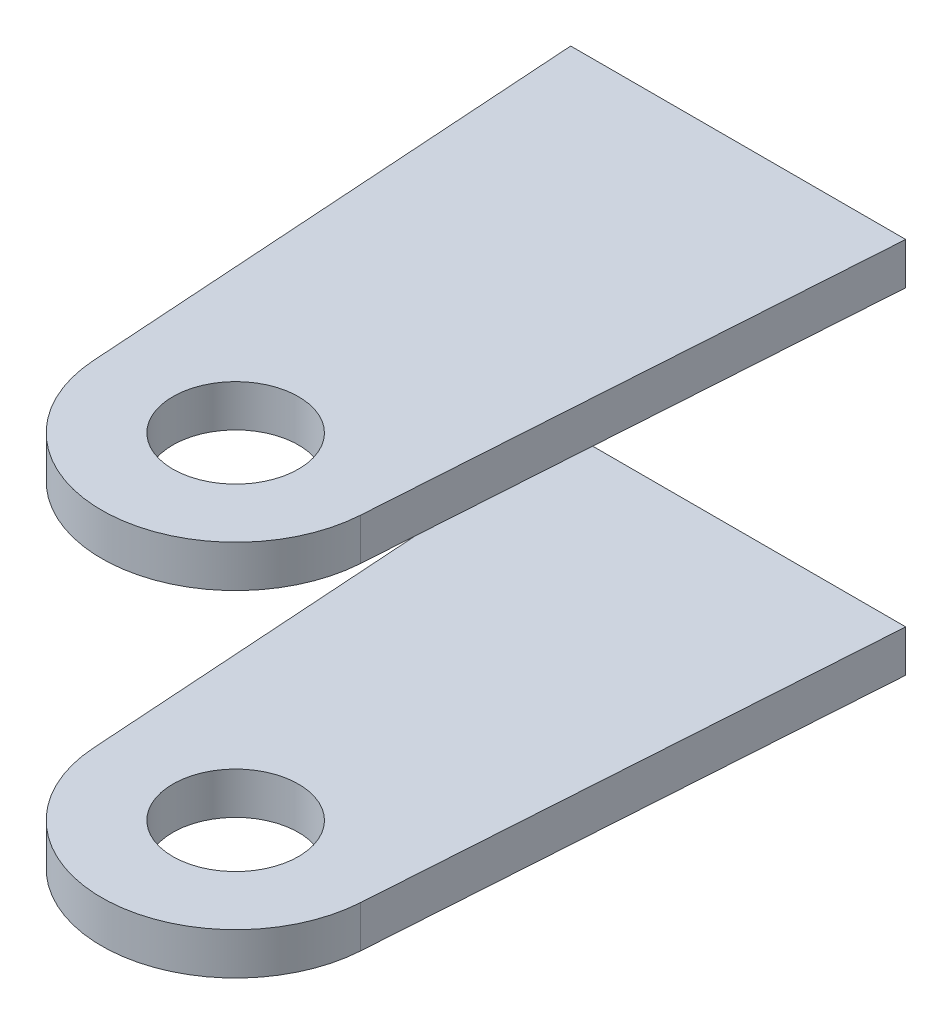
ISO-10303-21;
HEADER;
FILE_DESCRIPTION(('STEP AP214'),'2;1');
FILE_NAME('part.step','',(''),(''),'','','');
FILE_SCHEMA(('AUTOMOTIVE_DESIGN { 1 0 10303 214 1 1 1 1 }'));
ENDSEC;
DATA;
#1=APPLICATION_CONTEXT('core data for automotive mechanical design processes');
#2=APPLICATION_PROTOCOL_DEFINITION('international standard','automotive_design',2000,#1);
#3=PRODUCT_CONTEXT('',#1,'mechanical');
#4=PRODUCT('Part','Part','',(#3));
#5=PRODUCT_RELATED_PRODUCT_CATEGORY('part','',(#4));
#6=PRODUCT_DEFINITION_FORMATION('','',#4);
#7=PRODUCT_DEFINITION_CONTEXT('part definition',#1,'design');
#8=PRODUCT_DEFINITION('design','',#6,#7);
#9=PRODUCT_DEFINITION_SHAPE('','',#8);
#10=(LENGTH_UNIT() NAMED_UNIT(*) SI_UNIT(.MILLI.,.METRE.));
#11=(NAMED_UNIT(*) PLANE_ANGLE_UNIT() SI_UNIT($,.RADIAN.));
#12=(NAMED_UNIT(*) SI_UNIT($,.STERADIAN.) SOLID_ANGLE_UNIT());
#13=UNCERTAINTY_MEASURE_WITH_UNIT(LENGTH_MEASURE(1.E-05),#10,'distance_accuracy_value','');
#14=(GEOMETRIC_REPRESENTATION_CONTEXT(3) GLOBAL_UNCERTAINTY_ASSIGNED_CONTEXT((#13)) GLOBAL_UNIT_ASSIGNED_CONTEXT((#10,
#11,#12)) REPRESENTATION_CONTEXT('',''));
#15=CARTESIAN_POINT('',(0.,0.,0.));
#16=DIRECTION('',(0.,0.,1.));
#17=DIRECTION('',(1.,0.,0.));
#18=AXIS2_PLACEMENT_3D('',#15,#16,#17);
#19=CARTESIAN_POINT('',(0.,-14.30655,-38.1));
#20=DIRECTION('',(0.,0.,1.));
#21=DIRECTION('',(1.,0.,0.));
#22=AXIS2_PLACEMENT_3D('',#19,#20,#21);
#23=PLANE('',#22);
#24=DIRECTION('',(1.,0.,0.));
#25=VECTOR('',#24,1.);
#26=CARTESIAN_POINT('',(0.,-11.13155,-38.1));
#27=LINE('',#26,#25);
#28=CARTESIAN_POINT('',(-12.7,-11.13155,-38.1));
#29=VERTEX_POINT('',#28);
#30=CARTESIAN_POINT('',(12.7,-11.13155,-38.1));
#31=VERTEX_POINT('',#30);
#32=EDGE_CURVE('E119',#29,#31,#27,.T.);
#33=ORIENTED_EDGE('',*,*,#32,.T.);
#34=DIRECTION('',(0.,1.,0.));
#35=VECTOR('',#34,1.);
#36=CARTESIAN_POINT('',(12.7,-14.30655,-38.1));
#37=LINE('',#36,#35);
#38=CARTESIAN_POINT('',(12.7,-14.30655,-38.1));
#39=VERTEX_POINT('',#38);
#40=EDGE_CURVE('E12',#39,#31,#37,.T.);
#41=ORIENTED_EDGE('',*,*,#40,.F.);
#42=DIRECTION('',(1.,0.,0.));
#43=VECTOR('',#42,1.);
#44=CARTESIAN_POINT('',(0.,-14.30655,-38.1));
#45=LINE('',#44,#43);
#46=CARTESIAN_POINT('',(-12.7,-14.30655,-38.1));
#47=VERTEX_POINT('',#46);
#48=EDGE_CURVE('E71',#47,#39,#45,.T.);
#49=ORIENTED_EDGE('',*,*,#48,.F.);
#50=DIRECTION('',(0.,1.,0.));
#51=VECTOR('',#50,1.);
#52=CARTESIAN_POINT('',(-12.7,-14.30655,-38.1));
#53=LINE('',#52,#51);
#54=EDGE_CURVE('E56',#47,#29,#53,.T.);
#55=ORIENTED_EDGE('',*,*,#54,.T.);
#56=EDGE_LOOP('',(#33,#41,#49,#55));
#57=FACE_BOUND('',#56,.T.);
#58=ADVANCED_FACE('F53',(#57),#23,.F.);
#59=CARTESIAN_POINT('',(10.1378868864585,-14.30655,0.669962295486161));
#60=DIRECTION('',(0.997823512446701,0.,0.065941170815567));
#61=DIRECTION('',(0.065941170815567,0.,-0.997823512446701));
#62=AXIS2_PLACEMENT_3D('',#59,#60,#61);
#63=PLANE('',#62);
#64=DIRECTION('',(0.065941170815567,0.,-0.997823512446701));
#65=VECTOR('',#64,1.);
#66=CARTESIAN_POINT('',(10.1378868864585,-11.13155,0.669962295486161));
#67=LINE('',#66,#65);
#68=CARTESIAN_POINT('',(10.1378868864585,-11.13155,0.669962295486162));
#69=VERTEX_POINT('',#68);
#70=EDGE_CURVE('E124',#69,#31,#67,.T.);
#71=ORIENTED_EDGE('',*,*,#70,.F.);
#72=DIRECTION('',(0.,1.,0.));
#73=VECTOR('',#72,1.);
#74=CARTESIAN_POINT('',(10.1378868864585,-14.30655,0.669962295486162));
#75=LINE('',#74,#73);
#76=CARTESIAN_POINT('',(10.1378868864585,-14.30655,0.669962295486162));
#77=VERTEX_POINT('',#76);
#78=EDGE_CURVE('E62',#77,#69,#75,.T.);
#79=ORIENTED_EDGE('',*,*,#78,.F.);
#80=DIRECTION('',(0.065941170815567,0.,-0.997823512446701));
#81=VECTOR('',#80,1.);
#82=CARTESIAN_POINT('',(10.1378868864585,-14.30655,0.669962295486161));
#83=LINE('',#82,#81);
#84=EDGE_CURVE('E111',#77,#39,#83,.T.);
#85=ORIENTED_EDGE('',*,*,#84,.T.);
#86=ORIENTED_EDGE('',*,*,#40,.T.);
#87=EDGE_LOOP('',(#71,#79,#85,#86));
#88=FACE_BOUND('',#87,.T.);
#89=ADVANCED_FACE('F145',(#88),#63,.T.);
#90=CARTESIAN_POINT('',(0.,-14.30655,0.));
#91=DIRECTION('',(0.,1.,0.));
#92=DIRECTION('',(0.,0.,1.));
#93=AXIS2_PLACEMENT_3D('',#90,#91,#92);
#94=CYLINDRICAL_SURFACE('',#93,10.16);
#95=CARTESIAN_POINT('',(0.,-11.13155,0.));
#96=DIRECTION('',(0.,1.,0.));
#97=DIRECTION('',(0.,0.,1.));
#98=AXIS2_PLACEMENT_3D('',#95,#96,#97);
#99=CIRCLE('',#98,10.16);
#100=CARTESIAN_POINT('',(-10.1378868864585,-11.13155,0.669962295486162));
#101=VERTEX_POINT('',#100);
#102=EDGE_CURVE('E103',#101,#69,#99,.T.);
#103=ORIENTED_EDGE('',*,*,#102,.F.);
#104=DIRECTION('',(0.,1.,0.));
#105=VECTOR('',#104,1.);
#106=CARTESIAN_POINT('',(-10.1378868864585,-14.30655,0.669962295486162));
#107=LINE('',#106,#105);
#108=CARTESIAN_POINT('',(-10.1378868864585,-14.30655,0.669962295486162));
#109=VERTEX_POINT('',#108);
#110=EDGE_CURVE('E100',#109,#101,#107,.T.);
#111=ORIENTED_EDGE('',*,*,#110,.F.);
#112=CARTESIAN_POINT('',(0.,-14.30655,0.));
#113=DIRECTION('',(0.,1.,0.));
#114=DIRECTION('',(0.,0.,1.));
#115=AXIS2_PLACEMENT_3D('',#112,#113,#114);
#116=CIRCLE('',#115,10.16);
#117=EDGE_CURVE('E102',#109,#77,#116,.T.);
#118=ORIENTED_EDGE('',*,*,#117,.T.);
#119=ORIENTED_EDGE('',*,*,#78,.T.);
#120=EDGE_LOOP('',(#103,#111,#118,#119));
#121=FACE_BOUND('',#120,.T.);
#122=ADVANCED_FACE('F101',(#121),#94,.T.);
#123=CARTESIAN_POINT('',(-10.1378868864585,-14.30655,0.669962295486161));
#124=DIRECTION('',(0.997823512446701,0.,-0.065941170815567));
#125=DIRECTION('',(-0.065941170815567,0.,-0.997823512446701));
#126=AXIS2_PLACEMENT_3D('',#123,#124,#125);
#127=PLANE('',#126);
#128=DIRECTION('',(-0.065941170815567,0.,-0.997823512446701));
#129=VECTOR('',#128,1.);
#130=CARTESIAN_POINT('',(-10.1378868864585,-11.13155,0.669962295486161));
#131=LINE('',#130,#129);
#132=EDGE_CURVE('E121',#101,#29,#131,.T.);
#133=ORIENTED_EDGE('',*,*,#132,.T.);
#134=ORIENTED_EDGE('',*,*,#54,.F.);
#135=DIRECTION('',(-0.065941170815567,0.,-0.997823512446701));
#136=VECTOR('',#135,1.);
#137=CARTESIAN_POINT('',(-10.1378868864585,-14.30655,0.669962295486161));
#138=LINE('',#137,#136);
#139=EDGE_CURVE('E97',#109,#47,#138,.T.);
#140=ORIENTED_EDGE('',*,*,#139,.F.);
#141=ORIENTED_EDGE('',*,*,#110,.T.);
#142=EDGE_LOOP('',(#133,#134,#140,#141));
#143=FACE_BOUND('',#142,.T.);
#144=ADVANCED_FACE('F106',(#143),#127,.F.);
#145=CARTESIAN_POINT('',(0.,-14.30655,0.));
#146=DIRECTION('',(0.,1.,0.));
#147=DIRECTION('',(0.,0.,1.));
#148=AXIS2_PLACEMENT_3D('',#145,#146,#147);
#149=CYLINDRICAL_SURFACE('',#148,4.7625);
#150=CARTESIAN_POINT('',(0.,-14.30655,0.));
#151=DIRECTION('',(0.,1.,0.));
#152=DIRECTION('',(0.,0.,1.));
#153=AXIS2_PLACEMENT_3D('',#150,#151,#152);
#154=CIRCLE('',#153,4.7625);
#155=CARTESIAN_POINT('',(0.,-14.30655,4.7625));
#156=VERTEX_POINT('',#155);
#157=EDGE_CURVE('E113',#156,#156,#154,.T.);
#158=ORIENTED_EDGE('',*,*,#157,.F.);
#159=EDGE_LOOP('',(#158));
#160=FACE_BOUND('',#159,.T.);
#161=CARTESIAN_POINT('',(0.,-11.13155,0.));
#162=DIRECTION('',(0.,1.,0.));
#163=DIRECTION('',(0.,0.,1.));
#164=AXIS2_PLACEMENT_3D('',#161,#162,#163);
#165=CIRCLE('',#164,4.7625);
#166=CARTESIAN_POINT('',(0.,-11.13155,4.7625));
#167=VERTEX_POINT('',#166);
#168=EDGE_CURVE('E127',#167,#167,#165,.T.);
#169=ORIENTED_EDGE('',*,*,#168,.T.);
#170=EDGE_LOOP('',(#169));
#171=FACE_BOUND('',#170,.T.);
#172=ADVANCED_FACE('F132',(#160,#171),#149,.F.);
#173=CARTESIAN_POINT('',(0.,-14.30655,0.));
#174=DIRECTION('',(0.,1.,0.));
#175=DIRECTION('',(0.,0.,1.));
#176=AXIS2_PLACEMENT_3D('',#173,#174,#175);
#177=PLANE('',#176);
#178=ORIENTED_EDGE('',*,*,#48,.T.);
#179=ORIENTED_EDGE('',*,*,#84,.F.);
#180=ORIENTED_EDGE('',*,*,#117,.F.);
#181=ORIENTED_EDGE('',*,*,#139,.T.);
#182=EDGE_LOOP('',(#178,#179,#180,#181));
#183=FACE_BOUND('',#182,.T.);
#184=ORIENTED_EDGE('',*,*,#157,.T.);
#185=EDGE_LOOP('',(#184));
#186=FACE_BOUND('',#185,.T.);
#187=ADVANCED_FACE('F109',(#183,#186),#177,.F.);
#188=CARTESIAN_POINT('',(0.,-11.13155,0.));
#189=DIRECTION('',(0.,1.,0.));
#190=DIRECTION('',(0.,0.,1.));
#191=AXIS2_PLACEMENT_3D('',#188,#189,#190);
#192=PLANE('',#191);
#193=ORIENTED_EDGE('',*,*,#32,.F.);
#194=ORIENTED_EDGE('',*,*,#132,.F.);
#195=ORIENTED_EDGE('',*,*,#102,.T.);
#196=ORIENTED_EDGE('',*,*,#70,.T.);
#197=EDGE_LOOP('',(#193,#194,#195,#196));
#198=FACE_BOUND('',#197,.T.);
#199=ORIENTED_EDGE('',*,*,#168,.F.);
#200=EDGE_LOOP('',(#199));
#201=FACE_BOUND('',#200,.T.);
#202=ADVANCED_FACE('F134',(#198,#201),#192,.T.);
#203=CLOSED_SHELL('',(#58,#89,#122,#144,#172,#187,#202));
#204=MANIFOLD_SOLID_BREP('B2',#203);
#205=CARTESIAN_POINT('',(-10.1378868864585,14.30655,0.669962295486161));
#206=DIRECTION('',(-0.997823512446701,0.,0.065941170815567));
#207=DIRECTION('',(0.065941170815567,0.,0.997823512446701));
#208=AXIS2_PLACEMENT_3D('',#205,#206,#207);
#209=PLANE('',#208);
#210=DIRECTION('',(-0.065941170815567,0.,-0.997823512446701));
#211=VECTOR('',#210,1.);
#212=CARTESIAN_POINT('',(-10.1378868864585,11.13155,0.669962295486161));
#213=LINE('',#212,#211);
#214=CARTESIAN_POINT('',(-10.1378868864585,11.13155,0.669962295486162));
#215=VERTEX_POINT('',#214);
#216=CARTESIAN_POINT('',(-12.7,11.13155,-38.1));
#217=VERTEX_POINT('',#216);
#218=EDGE_CURVE('E277',#215,#217,#213,.T.);
#219=ORIENTED_EDGE('',*,*,#218,.F.);
#220=DIRECTION('',(0.,-1.,0.));
#221=VECTOR('',#220,1.);
#222=CARTESIAN_POINT('',(-10.1378868864585,14.30655,0.669962295486162));
#223=LINE('',#222,#221);
#224=CARTESIAN_POINT('',(-10.1378868864585,14.30655,0.669962295486162));
#225=VERTEX_POINT('',#224);
#226=EDGE_CURVE('E51',#225,#215,#223,.T.);
#227=ORIENTED_EDGE('',*,*,#226,.F.);
#228=DIRECTION('',(-0.065941170815567,0.,-0.997823512446701));
#229=VECTOR('',#228,1.);
#230=CARTESIAN_POINT('',(-10.1378868864585,14.30655,0.669962295486161));
#231=LINE('',#230,#229);
#232=CARTESIAN_POINT('',(-12.7,14.30655,-38.1));
#233=VERTEX_POINT('',#232);
#234=EDGE_CURVE('E259',#225,#233,#231,.T.);
#235=ORIENTED_EDGE('',*,*,#234,.T.);
#236=DIRECTION('',(0.,-1.,0.));
#237=VECTOR('',#236,1.);
#238=CARTESIAN_POINT('',(-12.7,14.30655,-38.1));
#239=LINE('',#238,#237);
#240=EDGE_CURVE('E226',#233,#217,#239,.T.);
#241=ORIENTED_EDGE('',*,*,#240,.T.);
#242=EDGE_LOOP('',(#219,#227,#235,#241));
#243=FACE_BOUND('',#242,.T.);
#244=ADVANCED_FACE('F210',(#243),#209,.T.);
#245=CARTESIAN_POINT('',(0.,14.30655,0.));
#246=DIRECTION('',(0.,-1.,0.));
#247=DIRECTION('',(0.,0.,-1.));
#248=AXIS2_PLACEMENT_3D('',#245,#246,#247);
#249=CYLINDRICAL_SURFACE('',#248,10.16);
#250=CARTESIAN_POINT('',(0.,11.13155,0.));
#251=DIRECTION('',(0.,1.,0.));
#252=DIRECTION('',(0.,0.,1.));
#253=AXIS2_PLACEMENT_3D('',#250,#251,#252);
#254=CIRCLE('',#253,10.16);
#255=CARTESIAN_POINT('',(10.1378868864585,11.13155,0.669962295486162));
#256=VERTEX_POINT('',#255);
#257=EDGE_CURVE('E265',#215,#256,#254,.T.);
#258=ORIENTED_EDGE('',*,*,#257,.T.);
#259=DIRECTION('',(0.,-1.,0.));
#260=VECTOR('',#259,1.);
#261=CARTESIAN_POINT('',(10.1378868864585,14.30655,0.669962295486162));
#262=LINE('',#261,#260);
#263=CARTESIAN_POINT('',(10.1378868864585,14.30655,0.669962295486162));
#264=VERTEX_POINT('',#263);
#265=EDGE_CURVE('E218',#264,#256,#262,.T.);
#266=ORIENTED_EDGE('',*,*,#265,.F.);
#267=CARTESIAN_POINT('',(0.,14.30655,0.));
#268=DIRECTION('',(0.,1.,0.));
#269=DIRECTION('',(0.,0.,1.));
#270=AXIS2_PLACEMENT_3D('',#267,#268,#269);
#271=CIRCLE('',#270,10.16);
#272=EDGE_CURVE('E252',#225,#264,#271,.T.);
#273=ORIENTED_EDGE('',*,*,#272,.F.);
#274=ORIENTED_EDGE('',*,*,#226,.T.);
#275=EDGE_LOOP('',(#258,#266,#273,#274));
#276=FACE_BOUND('',#275,.T.);
#277=ADVANCED_FACE('F263',(#276),#249,.T.);
#278=CARTESIAN_POINT('',(10.1378868864585,14.30655,0.669962295486161));
#279=DIRECTION('',(-0.997823512446701,0.,-0.065941170815567));
#280=DIRECTION('',(-0.065941170815567,0.,0.997823512446701));
#281=AXIS2_PLACEMENT_3D('',#278,#279,#280);
#282=PLANE('',#281);
#283=DIRECTION('',(0.065941170815567,0.,-0.997823512446701));
#284=VECTOR('',#283,1.);
#285=CARTESIAN_POINT('',(10.1378868864585,11.13155,0.669962295486161));
#286=LINE('',#285,#284);
#287=CARTESIAN_POINT('',(12.7,11.13155,-38.1));
#288=VERTEX_POINT('',#287);
#289=EDGE_CURVE('E280',#256,#288,#286,.T.);
#290=ORIENTED_EDGE('',*,*,#289,.T.);
#291=DIRECTION('',(0.,-1.,0.));
#292=VECTOR('',#291,1.);
#293=CARTESIAN_POINT('',(12.7,14.30655,-38.1));
#294=LINE('',#293,#292);
#295=CARTESIAN_POINT('',(12.7,14.30655,-38.1));
#296=VERTEX_POINT('',#295);
#297=EDGE_CURVE('E240',#296,#288,#294,.T.);
#298=ORIENTED_EDGE('',*,*,#297,.F.);
#299=DIRECTION('',(0.065941170815567,0.,-0.997823512446701));
#300=VECTOR('',#299,1.);
#301=CARTESIAN_POINT('',(10.1378868864585,14.30655,0.669962295486161));
#302=LINE('',#301,#300);
#303=EDGE_CURVE('E258',#264,#296,#302,.T.);
#304=ORIENTED_EDGE('',*,*,#303,.F.);
#305=ORIENTED_EDGE('',*,*,#265,.T.);
#306=EDGE_LOOP('',(#290,#298,#304,#305));
#307=FACE_BOUND('',#306,.T.);
#308=ADVANCED_FACE('F268',(#307),#282,.F.);
#309=CARTESIAN_POINT('',(0.,14.30655,-38.1));
#310=DIRECTION('',(0.,0.,-1.));
#311=DIRECTION('',(-1.,0.,0.));
#312=AXIS2_PLACEMENT_3D('',#309,#310,#311);
#313=PLANE('',#312);
#314=DIRECTION('',(1.,0.,0.));
#315=VECTOR('',#314,1.);
#316=CARTESIAN_POINT('',(0.,11.13155,-38.1));
#317=LINE('',#316,#315);
#318=EDGE_CURVE('E282',#217,#288,#317,.T.);
#319=ORIENTED_EDGE('',*,*,#318,.F.);
#320=ORIENTED_EDGE('',*,*,#240,.F.);
#321=DIRECTION('',(1.,0.,0.));
#322=VECTOR('',#321,1.);
#323=CARTESIAN_POINT('',(0.,14.30655,-38.1));
#324=LINE('',#323,#322);
#325=EDGE_CURVE('E269',#233,#296,#324,.T.);
#326=ORIENTED_EDGE('',*,*,#325,.T.);
#327=ORIENTED_EDGE('',*,*,#297,.T.);
#328=EDGE_LOOP('',(#319,#320,#326,#327));
#329=FACE_BOUND('',#328,.T.);
#330=ADVANCED_FACE('F291',(#329),#313,.T.);
#331=CARTESIAN_POINT('',(0.,14.30655,0.));
#332=DIRECTION('',(0.,-1.,0.));
#333=DIRECTION('',(0.,0.,-1.));
#334=AXIS2_PLACEMENT_3D('',#331,#332,#333);
#335=CYLINDRICAL_SURFACE('',#334,4.7625);
#336=CARTESIAN_POINT('',(0.,14.30655,0.));
#337=DIRECTION('',(0.,1.,0.));
#338=DIRECTION('',(0.,0.,1.));
#339=AXIS2_PLACEMENT_3D('',#336,#337,#338);
#340=CIRCLE('',#339,4.7625);
#341=CARTESIAN_POINT('',(0.,14.30655,4.7625));
#342=VERTEX_POINT('',#341);
#343=EDGE_CURVE('E271',#342,#342,#340,.T.);
#344=ORIENTED_EDGE('',*,*,#343,.T.);
#345=EDGE_LOOP('',(#344));
#346=FACE_BOUND('',#345,.T.);
#347=CARTESIAN_POINT('',(0.,11.13155,0.));
#348=DIRECTION('',(0.,1.,0.));
#349=DIRECTION('',(0.,0.,1.));
#350=AXIS2_PLACEMENT_3D('',#347,#348,#349);
#351=CIRCLE('',#350,4.7625);
#352=CARTESIAN_POINT('',(0.,11.13155,4.7625));
#353=VERTEX_POINT('',#352);
#354=EDGE_CURVE('E285',#353,#353,#351,.T.);
#355=ORIENTED_EDGE('',*,*,#354,.F.);
#356=EDGE_LOOP('',(#355));
#357=FACE_BOUND('',#356,.T.);
#358=ADVANCED_FACE('F293',(#346,#357),#335,.F.);
#359=CARTESIAN_POINT('',(0.,14.30655,0.));
#360=DIRECTION('',(0.,1.,0.));
#361=DIRECTION('',(0.,0.,1.));
#362=AXIS2_PLACEMENT_3D('',#359,#360,#361);
#363=PLANE('',#362);
#364=ORIENTED_EDGE('',*,*,#234,.F.);
#365=ORIENTED_EDGE('',*,*,#272,.T.);
#366=ORIENTED_EDGE('',*,*,#303,.T.);
#367=ORIENTED_EDGE('',*,*,#325,.F.);
#368=EDGE_LOOP('',(#364,#365,#366,#367));
#369=FACE_BOUND('',#368,.T.);
#370=ORIENTED_EDGE('',*,*,#343,.F.);
#371=EDGE_LOOP('',(#370));
#372=FACE_BOUND('',#371,.T.);
#373=ADVANCED_FACE('F254',(#369,#372),#363,.T.);
#374=CARTESIAN_POINT('',(0.,11.13155,0.));
#375=DIRECTION('',(0.,1.,0.));
#376=DIRECTION('',(0.,0.,1.));
#377=AXIS2_PLACEMENT_3D('',#374,#375,#376);
#378=PLANE('',#377);
#379=ORIENTED_EDGE('',*,*,#218,.T.);
#380=ORIENTED_EDGE('',*,*,#318,.T.);
#381=ORIENTED_EDGE('',*,*,#289,.F.);
#382=ORIENTED_EDGE('',*,*,#257,.F.);
#383=EDGE_LOOP('',(#379,#380,#381,#382));
#384=FACE_BOUND('',#383,.T.);
#385=ORIENTED_EDGE('',*,*,#354,.T.);
#386=EDGE_LOOP('',(#385));
#387=FACE_BOUND('',#386,.T.);
#388=ADVANCED_FACE('F316',(#384,#387),#378,.F.);
#389=CLOSED_SHELL('',(#244,#277,#308,#330,#358,#373,#388));
#390=MANIFOLD_SOLID_BREP('B6',#389);
#391=ADVANCED_BREP_SHAPE_REPRESENTATION('',(#18,#204,#390),#14);
#392=SHAPE_DEFINITION_REPRESENTATION(#9,#391);
ENDSEC;
END-ISO-10303-21;
